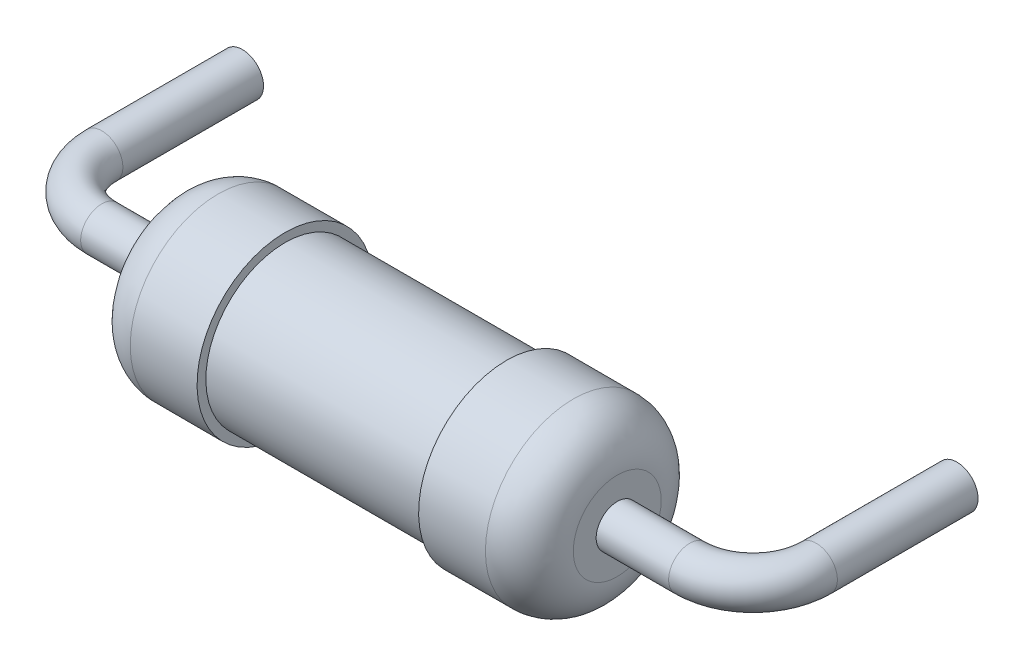
ISO-10303-21;
HEADER;
FILE_DESCRIPTION(('STEP AP214'),'2;1');
FILE_NAME('part.step','',(''),(''),'','','');
FILE_SCHEMA(('AUTOMOTIVE_DESIGN { 1 0 10303 214 1 1 1 1 }'));
ENDSEC;
DATA;
#1=APPLICATION_CONTEXT('core data for automotive mechanical design processes');
#2=APPLICATION_PROTOCOL_DEFINITION('international standard','automotive_design',2000,#1);
#3=PRODUCT_CONTEXT('',#1,'mechanical');
#4=PRODUCT('Part','Part','',(#3));
#5=PRODUCT_RELATED_PRODUCT_CATEGORY('part','',(#4));
#6=PRODUCT_DEFINITION_FORMATION('','',#4);
#7=PRODUCT_DEFINITION_CONTEXT('part definition',#1,'design');
#8=PRODUCT_DEFINITION('design','',#6,#7);
#9=PRODUCT_DEFINITION_SHAPE('','',#8);
#10=(LENGTH_UNIT() NAMED_UNIT(*) SI_UNIT(.MILLI.,.METRE.));
#11=(NAMED_UNIT(*) PLANE_ANGLE_UNIT() SI_UNIT($,.RADIAN.));
#12=(NAMED_UNIT(*) SI_UNIT($,.STERADIAN.) SOLID_ANGLE_UNIT());
#13=UNCERTAINTY_MEASURE_WITH_UNIT(LENGTH_MEASURE(1.E-05),#10,'distance_accuracy_value','');
#14=(GEOMETRIC_REPRESENTATION_CONTEXT(3) GLOBAL_UNCERTAINTY_ASSIGNED_CONTEXT((#13)) GLOBAL_UNIT_ASSIGNED_CONTEXT((#10,
#11,#12)) REPRESENTATION_CONTEXT('',''));
#15=CARTESIAN_POINT('',(0.,0.,0.));
#16=DIRECTION('',(0.,0.,1.));
#17=DIRECTION('',(1.,0.,0.));
#18=AXIS2_PLACEMENT_3D('',#15,#16,#17);
#19=CARTESIAN_POINT('',(10.1599999999998,0.,0.35));
#20=DIRECTION('',(0.,0.,1.));
#21=DIRECTION('',(1.,-5.51018547908294E-13,0.));
#22=AXIS2_PLACEMENT_3D('',#19,#20,#21);
#23=CYLINDRICAL_SURFACE('',#22,0.300000000000225);
#24=CARTESIAN_POINT('',(10.16,0.,0.35));
#25=DIRECTION('',(0.,0.,1.));
#26=DIRECTION('',(-0.829113924050626,0.559079691050725,0.));
#27=AXIS2_PLACEMENT_3D('',#24,#25,#26);
#28=CIRCLE('',#27,0.299999999999989);
#29=CARTESIAN_POINT('',(9.86,0.,0.35));
#30=VERTEX_POINT('',#29);
#31=EDGE_CURVE('E25',#30,#30,#28,.T.);
#32=ORIENTED_EDGE('',*,*,#31,.F.);
#33=DIRECTION('',(0.,0.,-1.));
#34=VECTOR('',#33,1.);
#35=CARTESIAN_POINT('',(9.85999999999955,1.65104899379408E-13,0.35));
#36=LINE('',#35,#34);
#37=CARTESIAN_POINT('',(9.86,0.,-1.64999994635582));
#38=VERTEX_POINT('',#37);
#39=EDGE_CURVE('E11',#30,#38,#36,.T.);
#40=ORIENTED_EDGE('',*,*,#39,.T.);
#41=CARTESIAN_POINT('',(10.1599999999998,0.,-1.64999994635582));
#42=DIRECTION('',(0.,0.,1.));
#43=DIRECTION('',(1.,-5.51018547908294E-13,0.));
#44=AXIS2_PLACEMENT_3D('',#41,#42,#43);
#45=CIRCLE('',#44,0.300000000000225);
#46=EDGE_CURVE('E175',#38,#38,#45,.T.);
#47=ORIENTED_EDGE('',*,*,#46,.T.);
#48=ORIENTED_EDGE('',*,*,#39,.F.);
#49=EDGE_LOOP('',(#32,#40,#47,#48));
#50=FACE_BOUND('',#49,.T.);
#51=ADVANCED_FACE('F17',(#50),#23,.T.);
#52=CARTESIAN_POINT('',(9.25999999999962,-3.80883709701122E-13,0.349999999999632));
#53=DIRECTION('',(3.56489670335381E-13,-1.,2.67467843021535E-13));
#54=DIRECTION('',(0.,-2.67467843021535E-13,-1.));
#55=AXIS2_PLACEMENT_3D('',#52,#53,#54);
#56=TOROIDAL_SURFACE('',#55,0.900000000000287,0.299999999999851);
#57=CARTESIAN_POINT('',(9.26,0.,1.25));
#58=DIRECTION('',(1.,0.,0.));
#59=DIRECTION('',(0.,-0.559079691050551,-0.829113924050742));
#60=AXIS2_PLACEMENT_3D('',#57,#58,#59);
#61=CIRCLE('',#60,0.299999999999987);
#62=CARTESIAN_POINT('',(9.26,0.,0.95));
#63=VERTEX_POINT('',#62);
#64=EDGE_CURVE('E145',#63,#63,#61,.T.);
#65=ORIENTED_EDGE('',*,*,#64,.T.);
#66=CARTESIAN_POINT('',(9.25999999999962,-3.80846970297148E-13,0.349999999999632));
#67=DIRECTION('',(-3.56489670335381E-13,1.,-2.67467843021535E-13));
#68=DIRECTION('',(0.,-2.67467843021535E-13,-1.));
#69=AXIS2_PLACEMENT_3D('',#66,#67,#68);
#70=CIRCLE('',#69,0.600000000000436);
#71=EDGE_CURVE('E44',#63,#30,#70,.T.);
#72=ORIENTED_EDGE('',*,*,#71,.T.);
#73=ORIENTED_EDGE('',*,*,#31,.T.);
#74=ORIENTED_EDGE('',*,*,#71,.F.);
#75=EDGE_LOOP('',(#65,#72,#73,#74));
#76=FACE_BOUND('',#75,.T.);
#77=ADVANCED_FACE('F173',(#76),#56,.T.);
#78=CARTESIAN_POINT('',(8.23,0.,1.24999999999977));
#79=DIRECTION('',(-1.,0.,0.));
#80=DIRECTION('',(0.,-5.51377500943084E-13,1.));
#81=AXIS2_PLACEMENT_3D('',#78,#79,#80);
#82=CYLINDRICAL_SURFACE('',#81,0.300000000000227);
#83=CARTESIAN_POINT('',(8.23,0.,1.25));
#84=DIRECTION('',(1.,0.,0.));
#85=DIRECTION('',(0.,-0.559079691050551,-0.829113924050742));
#86=AXIS2_PLACEMENT_3D('',#83,#84,#85);
#87=CIRCLE('',#86,0.299999999999987);
#88=CARTESIAN_POINT('',(8.23,0.,0.95));
#89=VERTEX_POINT('',#88);
#90=EDGE_CURVE('E165',#89,#89,#87,.T.);
#91=ORIENTED_EDGE('',*,*,#90,.T.);
#92=DIRECTION('',(1.,0.,0.));
#93=VECTOR('',#92,1.);
#94=CARTESIAN_POINT('',(8.23,1.65320271200286E-13,0.949999999999545));
#95=LINE('',#94,#93);
#96=EDGE_CURVE('E148',#89,#63,#95,.T.);
#97=ORIENTED_EDGE('',*,*,#96,.T.);
#98=ORIENTED_EDGE('',*,*,#64,.F.);
#99=ORIENTED_EDGE('',*,*,#96,.F.);
#100=EDGE_LOOP('',(#91,#97,#98,#99));
#101=FACE_BOUND('',#100,.T.);
#102=ADVANCED_FACE('F234',(#101),#82,.T.);
#103=CARTESIAN_POINT('',(8.23,0.625,1.25));
#104=DIRECTION('',(-1.,0.,0.));
#105=DIRECTION('',(0.,0.,1.));
#106=AXIS2_PLACEMENT_3D('',#103,#104,#105);
#107=PLANE('',#106);
#108=ORIENTED_EDGE('',*,*,#90,.F.);
#109=EDGE_LOOP('',(#108));
#110=FACE_BOUND('',#109,.T.);
#111=CARTESIAN_POINT('',(8.23,0.,1.24999999999991));
#112=DIRECTION('',(1.,0.,0.));
#113=DIRECTION('',(0.,0.829113924050749,-0.559079691050541));
#114=AXIS2_PLACEMENT_3D('',#111,#112,#113);
#115=CIRCLE('',#114,0.625);
#116=CARTESIAN_POINT('',(8.23,-4.35651416825784E-13,0.624999999999913));
#117=VERTEX_POINT('',#116);
#118=EDGE_CURVE('E160',#117,#117,#115,.T.);
#119=ORIENTED_EDGE('',*,*,#118,.T.);
#120=EDGE_LOOP('',(#119));
#121=FACE_BOUND('',#120,.T.);
#122=ADVANCED_FACE('F237',(#110,#121),#107,.F.);
#123=CARTESIAN_POINT('',(8.23000000000021,-4.35574876400854E-13,0.625000000000753));
#124=CARTESIAN_POINT('',(8.23000000000015,-0.624999999999856,0.625000000000753));
#125=CARTESIAN_POINT('',(8.23,-0.624999999999857,1.25000000000017));
#126=CARTESIAN_POINT('',(8.22999999999992,-0.624999999999856,1.8749999999996));
#127=CARTESIAN_POINT('',(8.23,-4.35574876400854E-13,1.8749999999996));
#128=CARTESIAN_POINT('',(8.23,0.624999999998985,1.8749999999996));
#129=CARTESIAN_POINT('',(8.23000000000013,0.624999999998985,1.25000000000017));
#130=CARTESIAN_POINT('',(8.23000000000025,0.624999999998985,0.625000000000753));
#131=CARTESIAN_POINT('',(8.23000000000021,-4.35574876400854E-13,0.625000000000753));
#132=CARTESIAN_POINT('',(8.23000000000085,-4.35574876400892E-13,-1.12687636999453E-13));
#133=CARTESIAN_POINT('',(8.23000000000076,-1.25000000000072,-1.12410081243297E-13));
#134=CARTESIAN_POINT('',(8.2300000000005,-1.25000000000072,1.25000000000017));
#135=CARTESIAN_POINT('',(8.23000000000025,-1.25000000000072,2.50000000000046));
#136=CARTESIAN_POINT('',(8.23000000000035,-4.35574876400892E-13,2.50000000000046));
#137=CARTESIAN_POINT('',(8.23000000000043,1.24999999999985,2.50000000000046));
#138=CARTESIAN_POINT('',(8.23000000000068,1.24999999999985,1.25000000000017));
#139=CARTESIAN_POINT('',(8.23000000000095,1.24999999999985,-1.12410081243297E-13));
#140=CARTESIAN_POINT('',(8.23000000000085,-4.35574876400892E-13,-1.12687636999453E-13));
#141=CARTESIAN_POINT('',(7.605,-3.88161724984572E-13,-2.59792187762287E-13));
#142=CARTESIAN_POINT('',(7.60499999999989,-1.25000000000069,-2.5951463200613E-13));
#143=CARTESIAN_POINT('',(7.60499999999964,-1.25000000000069,1.25000000000005));
#144=CARTESIAN_POINT('',(7.60499999999938,-1.25000000000069,2.50000000000035));
#145=CARTESIAN_POINT('',(7.60499999999947,-3.88161724984572E-13,2.50000000000035));
#146=CARTESIAN_POINT('',(7.60499999999956,1.24999999999992,2.50000000000035));
#147=CARTESIAN_POINT('',(7.60499999999982,1.24999999999992,1.25000000000005));
#148=CARTESIAN_POINT('',(7.60500000000009,1.24999999999992,-2.5951463200613E-13));
#149=CARTESIAN_POINT('',(7.605,-3.88161724984572E-13,-2.59792187762287E-13));
#150=(BOUNDED_SURFACE() B_SPLINE_SURFACE(2,2,((#123,#124,#125,#126,#127,#128,#129,#130,#131),
(#132,#133,#134,#135,#136,#137,#138,#139,#140),(#141,#142,#143,#144,#145,#146,#147,#148,#149)),
.UNSPECIFIED.,.F.,.T.,.F.) B_SPLINE_SURFACE_WITH_KNOTS((3,3),(3,2,2,2,3),(-1.57079632679571,0.),
(-3.14159265358979,-1.5707963267949,0.,1.5707963267949,3.14159265358979),
.UNSPECIFIED.) GEOMETRIC_REPRESENTATION_ITEM() RATIONAL_B_SPLINE_SURFACE(((1.,0.707106781186548,
1.,0.707106781186548,1.,0.707106781186548,1.,0.707106781186548,1.),(0.707106781186268,
0.499999999999802,0.707106781186268,0.499999999999802,0.707106781186268,0.499999999999802,
0.707106781186268,0.499999999999802,0.707106781186268),(1.,0.707106781186548,1.,
0.707106781186548,1.,0.707106781186548,1.,0.707106781186548,1.))) REPRESENTATION_ITEM('') SURFACE());
#151=CARTESIAN_POINT('',(7.605,0.,1.24999999999998));
#152=DIRECTION('',(1.,0.,0.));
#153=DIRECTION('',(0.,0.829113924050755,-0.559079691050533));
#154=AXIS2_PLACEMENT_3D('',#151,#152,#153);
#155=CIRCLE('',#154,1.25000000000003);
#156=CARTESIAN_POINT('',(7.605,1.25,1.25));
#157=VERTEX_POINT('',#156);
#158=CARTESIAN_POINT('',(7.605,-3.88314805834467E-13,0.));
#159=VERTEX_POINT('',#158);
#160=EDGE_CURVE('E120',#157,#159,#155,.T.);
#161=CARTESIAN_POINT('',(7.60499999999984,-3.88238265409517E-13,0.625000000000114));
#162=DIRECTION('',(0.,-1.,0.));
#163=DIRECTION('',(2.04281036530979E-13,0.,-1.));
#164=AXIS2_PLACEMENT_3D('',#161,#162,#163);
#165=CIRCLE('',#164,0.625000000000374);
#166=EDGE_CURVE('E156',#159,#117,#165,.T.);
#167=CARTESIAN_POINT('',(7.605,0.,1.24999999999998));
#168=DIRECTION('',(1.,0.,0.));
#169=DIRECTION('',(0.,0.829113924050755,-0.559079691050533));
#170=AXIS2_PLACEMENT_3D('',#167,#168,#169);
#171=CIRCLE('',#170,1.25000000000003);
#172=EDGE_CURVE('E152',#159,#157,#171,.T.);
#173=ORIENTED_EDGE('',*,*,#160,.T.);
#174=ORIENTED_EDGE('',*,*,#166,.T.);
#175=ORIENTED_EDGE('',*,*,#118,.F.);
#176=ORIENTED_EDGE('',*,*,#166,.F.);
#177=ORIENTED_EDGE('',*,*,#172,.T.);
#178=EDGE_LOOP('',(#173,#174,#175,#176,#177));
#179=FACE_BOUND('',#178,.T.);
#180=ADVANCED_FACE('F240',(#179),#150,.F.);
#181=CARTESIAN_POINT('',(2.27283469822481E-13,0.,-3.));
#182=DIRECTION('',(0.,0.,-1.));
#183=DIRECTION('',(-1.,-5.51511040018528E-13,0.));
#184=AXIS2_PLACEMENT_3D('',#181,#182,#183);
#185=CYLINDRICAL_SURFACE('',#184,0.300000000000227);
#186=CARTESIAN_POINT('',(2.27283469822481E-13,0.,-1.64999994635582));
#187=DIRECTION('',(0.,0.,1.));
#188=DIRECTION('',(-1.,-5.51511040018528E-13,0.));
#189=AXIS2_PLACEMENT_3D('',#186,#187,#188);
#190=CIRCLE('',#189,0.300000000000227);
#191=CARTESIAN_POINT('',(0.3,0.,-1.64999994635582));
#192=VERTEX_POINT('',#191);
#193=EDGE_CURVE('E179',#192,#192,#190,.T.);
#194=ORIENTED_EDGE('',*,*,#193,.T.);
#195=DIRECTION('',(0.,0.,1.));
#196=VECTOR('',#195,1.);
#197=CARTESIAN_POINT('',(0.300000000000455,1.65400394645552E-13,-3.));
#198=LINE('',#197,#196);
#199=CARTESIAN_POINT('',(0.3,0.,0.35));
#200=VERTEX_POINT('',#199);
#201=EDGE_CURVE('E155',#192,#200,#198,.T.);
#202=ORIENTED_EDGE('',*,*,#201,.T.);
#203=CARTESIAN_POINT('',(0.,0.,0.35));
#204=DIRECTION('',(0.,0.,1.));
#205=DIRECTION('',(0.829113924050743,-0.559079691050551,0.));
#206=AXIS2_PLACEMENT_3D('',#203,#204,#205);
#207=CIRCLE('',#206,0.299999999999987);
#208=EDGE_CURVE('E118',#200,#200,#207,.T.);
#209=ORIENTED_EDGE('',*,*,#208,.F.);
#210=ORIENTED_EDGE('',*,*,#201,.F.);
#211=EDGE_LOOP('',(#194,#202,#209,#210));
#212=FACE_BOUND('',#211,.T.);
#213=ADVANCED_FACE('F410',(#212),#185,.T.);
#214=CARTESIAN_POINT('',(7.605,-1.02001740387436E-13,1.25));
#215=DIRECTION('',(1.,0.,0.));
#216=DIRECTION('',(0.,-1.,5.51558798633823E-13));
#217=AXIS2_PLACEMENT_3D('',#214,#215,#216);
#218=CYLINDRICAL_SURFACE('',#217,1.2499999999999);
#219=ORIENTED_EDGE('',*,*,#160,.F.);
#220=DIRECTION('',(-1.,0.,0.));
#221=VECTOR('',#220,1.);
#222=CARTESIAN_POINT('',(7.605,1.2499999999998,1.24999999999931));
#223=LINE('',#222,#221);
#224=CARTESIAN_POINT('',(6.655,1.25,1.25));
#225=VERTEX_POINT('',#224);
#226=EDGE_CURVE('E142',#157,#225,#223,.T.);
#227=ORIENTED_EDGE('',*,*,#226,.T.);
#228=CARTESIAN_POINT('',(6.655,0.,1.24999999999998));
#229=DIRECTION('',(1.,0.,0.));
#230=DIRECTION('',(0.,0.829113924050755,-0.559079691050533));
#231=AXIS2_PLACEMENT_3D('',#228,#229,#230);
#232=CIRCLE('',#231,1.25000000000003);
#233=EDGE_CURVE('E129',#225,#225,#232,.T.);
#234=ORIENTED_EDGE('',*,*,#233,.T.);
#235=ORIENTED_EDGE('',*,*,#226,.F.);
#236=ORIENTED_EDGE('',*,*,#172,.F.);
#237=EDGE_LOOP('',(#219,#227,#234,#235,#236));
#238=FACE_BOUND('',#237,.T.);
#239=ADVANCED_FACE('F248',(#238),#218,.T.);
#240=CARTESIAN_POINT('',(0.900000000000377,-3.63692008992207E-13,0.349999999999616));
#241=DIRECTION('',(-2.50611026152485E-13,-1.,3.44823994173089E-13));
#242=DIRECTION('',(0.,-3.44823994173089E-13,-1.));
#243=AXIS2_PLACEMENT_3D('',#240,#241,#242);
#244=TOROIDAL_SURFACE('',#243,0.900000000000299,0.299999999999852);
#245=ORIENTED_EDGE('',*,*,#208,.T.);
#246=CARTESIAN_POINT('',(0.900000000000377,-3.63655269588233E-13,0.349999999999616));
#247=DIRECTION('',(2.50611026152485E-13,1.,-3.44823994173089E-13));
#248=DIRECTION('',(0.,-3.44823994173089E-13,-1.));
#249=AXIS2_PLACEMENT_3D('',#246,#247,#248);
#250=CIRCLE('',#249,0.600000000000447);
#251=CARTESIAN_POINT('',(0.9,0.,0.95));
#252=VERTEX_POINT('',#251);
#253=EDGE_CURVE('E112',#200,#252,#250,.T.);
#254=ORIENTED_EDGE('',*,*,#253,.T.);
#255=CARTESIAN_POINT('',(0.9,0.,1.25));
#256=DIRECTION('',(-1.,0.,0.));
#257=DIRECTION('',(0.,0.559079691050724,-0.829113924050626));
#258=AXIS2_PLACEMENT_3D('',#255,#256,#257);
#259=CIRCLE('',#258,0.299999999999987);
#260=EDGE_CURVE('E116',#252,#252,#259,.T.);
#261=ORIENTED_EDGE('',*,*,#260,.T.);
#262=ORIENTED_EDGE('',*,*,#253,.F.);
#263=EDGE_LOOP('',(#245,#254,#261,#262));
#264=FACE_BOUND('',#263,.T.);
#265=ADVANCED_FACE('F114',(#264),#244,.T.);
#266=CARTESIAN_POINT('',(6.655,1.25,1.25));
#267=DIRECTION('',(-1.,0.,0.));
#268=DIRECTION('',(0.,0.,1.));
#269=AXIS2_PLACEMENT_3D('',#266,#267,#268);
#270=PLANE('',#269);
#271=CARTESIAN_POINT('',(6.655,0.,1.24999999999996));
#272=DIRECTION('',(-1.,0.,0.));
#273=DIRECTION('',(0.,0.829113924050744,0.559079691050549));
#274=AXIS2_PLACEMENT_3D('',#271,#272,#273);
#275=CIRCLE('',#274,1.12499999999996);
#276=CARTESIAN_POINT('',(6.655,1.125,1.25));
#277=VERTEX_POINT('',#276);
#278=EDGE_CURVE('E195',#277,#277,#275,.T.);
#279=ORIENTED_EDGE('',*,*,#278,.F.);
#280=EDGE_LOOP('',(#279));
#281=FACE_BOUND('',#280,.T.);
#282=ORIENTED_EDGE('',*,*,#233,.F.);
#283=EDGE_LOOP('',(#282));
#284=FACE_BOUND('',#283,.T.);
#285=ADVANCED_FACE('F343',(#281,#284),#270,.T.);
#286=CARTESIAN_POINT('',(0.9,0.,1.24999999999977));
#287=DIRECTION('',(-1.,0.,0.));
#288=DIRECTION('',(0.,-5.51377500943084E-13,1.));
#289=AXIS2_PLACEMENT_3D('',#286,#287,#288);
#290=CYLINDRICAL_SURFACE('',#289,0.300000000000227);
#291=ORIENTED_EDGE('',*,*,#260,.F.);
#292=DIRECTION('',(1.,0.,0.));
#293=VECTOR('',#292,1.);
#294=CARTESIAN_POINT('',(0.9,1.65320271200286E-13,0.949999999999545));
#295=LINE('',#294,#293);
#296=CARTESIAN_POINT('',(1.93,0.,0.95));
#297=VERTEX_POINT('',#296);
#298=EDGE_CURVE('E124',#252,#297,#295,.T.);
#299=ORIENTED_EDGE('',*,*,#298,.T.);
#300=CARTESIAN_POINT('',(1.93,0.,1.25));
#301=DIRECTION('',(1.,0.,0.));
#302=DIRECTION('',(0.,-0.559079691050551,-0.829113924050742));
#303=AXIS2_PLACEMENT_3D('',#300,#301,#302);
#304=CIRCLE('',#303,0.299999999999987);
#305=EDGE_CURVE('E127',#297,#297,#304,.T.);
#306=ORIENTED_EDGE('',*,*,#305,.F.);
#307=ORIENTED_EDGE('',*,*,#298,.F.);
#308=EDGE_LOOP('',(#291,#299,#306,#307));
#309=FACE_BOUND('',#308,.T.);
#310=ADVANCED_FACE('F125',(#309),#290,.T.);
#311=CARTESIAN_POINT('',(6.655,0.,1.25));
#312=DIRECTION('',(1.,0.,0.));
#313=DIRECTION('',(0.,-1.,5.51410768897133E-13));
#314=AXIS2_PLACEMENT_3D('',#311,#312,#313);
#315=CYLINDRICAL_SURFACE('',#314,1.12500000000006);
#316=ORIENTED_EDGE('',*,*,#278,.T.);
#317=DIRECTION('',(-1.,0.,0.));
#318=VECTOR('',#317,1.);
#319=CARTESIAN_POINT('',(6.655,1.12500000000012,1.24999999999938));
#320=LINE('',#319,#318);
#321=CARTESIAN_POINT('',(3.505,1.125,1.25));
#322=VERTEX_POINT('',#321);
#323=EDGE_CURVE('E138',#277,#322,#320,.T.);
#324=ORIENTED_EDGE('',*,*,#323,.T.);
#325=CARTESIAN_POINT('',(3.505,0.,1.24999999999996));
#326=DIRECTION('',(-1.,0.,0.));
#327=DIRECTION('',(0.,0.829113924050744,0.559079691050549));
#328=AXIS2_PLACEMENT_3D('',#325,#326,#327);
#329=CIRCLE('',#328,1.12499999999996);
#330=EDGE_CURVE('E200',#322,#322,#329,.T.);
#331=ORIENTED_EDGE('',*,*,#330,.F.);
#332=ORIENTED_EDGE('',*,*,#323,.F.);
#333=EDGE_LOOP('',(#316,#324,#331,#332));
#334=FACE_BOUND('',#333,.T.);
#335=ADVANCED_FACE('F350',(#334),#315,.T.);
#336=CARTESIAN_POINT('',(1.93,0.625,1.25));
#337=DIRECTION('',(-1.,0.,0.));
#338=DIRECTION('',(0.,0.,1.));
#339=AXIS2_PLACEMENT_3D('',#336,#337,#338);
#340=PLANE('',#339);
#341=ORIENTED_EDGE('',*,*,#305,.T.);
#342=EDGE_LOOP('',(#341));
#343=FACE_BOUND('',#342,.T.);
#344=CARTESIAN_POINT('',(1.93,0.,1.24999999999991));
#345=DIRECTION('',(1.,0.,0.));
#346=DIRECTION('',(0.,0.829113924050749,-0.559079691050541));
#347=AXIS2_PLACEMENT_3D('',#344,#345,#346);
#348=CIRCLE('',#347,0.625);
#349=CARTESIAN_POINT('',(1.93,-4.39978178240688E-13,1.87499999999991));
#350=VERTEX_POINT('',#349);
#351=EDGE_CURVE('E192',#350,#350,#348,.T.);
#352=ORIENTED_EDGE('',*,*,#351,.F.);
#353=EDGE_LOOP('',(#352));
#354=FACE_BOUND('',#353,.T.);
#355=ADVANCED_FACE('F354',(#343,#354),#340,.T.);
#356=CARTESIAN_POINT('',(3.505,1.25,1.25));
#357=DIRECTION('',(-1.,0.,0.));
#358=DIRECTION('',(0.,0.,1.));
#359=AXIS2_PLACEMENT_3D('',#356,#357,#358);
#360=PLANE('',#359);
#361=ORIENTED_EDGE('',*,*,#330,.T.);
#362=EDGE_LOOP('',(#361));
#363=FACE_BOUND('',#362,.T.);
#364=CARTESIAN_POINT('',(3.505,0.,1.24999999999998));
#365=DIRECTION('',(1.,0.,0.));
#366=DIRECTION('',(0.,0.829113924050755,-0.559079691050533));
#367=AXIS2_PLACEMENT_3D('',#364,#365,#366);
#368=CIRCLE('',#367,1.25000000000003);
#369=CARTESIAN_POINT('',(3.505,1.25,1.25));
#370=VERTEX_POINT('',#369);
#371=EDGE_CURVE('E178',#370,#370,#368,.T.);
#372=ORIENTED_EDGE('',*,*,#371,.T.);
#373=EDGE_LOOP('',(#372));
#374=FACE_BOUND('',#373,.T.);
#375=ADVANCED_FACE('F383',(#363,#374),#360,.F.);
#376=CARTESIAN_POINT('',(1.92999999999979,-4.39901637815758E-13,1.87499999999933));
#377=CARTESIAN_POINT('',(1.92999999999984,-0.624999999999949,1.87499999999933));
#378=CARTESIAN_POINT('',(1.92999999999997,-0.624999999999949,1.24999999999982));
#379=CARTESIAN_POINT('',(1.93000000000009,-0.624999999999949,0.625000000000314));
#380=CARTESIAN_POINT('',(1.93000000000004,-4.39901637815758E-13,0.625000000000314));
#381=CARTESIAN_POINT('',(1.92999999999999,0.62499999999907,0.625000000000314));
#382=CARTESIAN_POINT('',(1.92999999999986,0.62499999999907,1.24999999999982));
#383=CARTESIAN_POINT('',(1.92999999999973,0.62499999999907,1.87499999999933));
#384=CARTESIAN_POINT('',(1.92999999999979,-4.39901637815758E-13,1.87499999999933));
#385=CARTESIAN_POINT('',(1.92999999999924,-4.39901637815793E-13,2.50000000000012));
#386=CARTESIAN_POINT('',(1.92999999999934,-1.25000000000073,2.50000000000012));
#387=CARTESIAN_POINT('',(1.9299999999996,-1.25000000000073,1.24999999999982));
#388=CARTESIAN_POINT('',(1.92999999999985,-1.25000000000073,-4.69346783660285E-13));
#389=CARTESIAN_POINT('',(1.92999999999975,-4.39901637815793E-13,-4.69624339416441E-13));
#390=CARTESIAN_POINT('',(1.92999999999965,1.24999999999985,-4.69346783660285E-13));
#391=CARTESIAN_POINT('',(1.92999999999939,1.24999999999985,1.24999999999982));
#392=CARTESIAN_POINT('',(1.92999999999913,1.24999999999985,2.50000000000012));
#393=CARTESIAN_POINT('',(1.92999999999924,-4.39901637815793E-13,2.50000000000012));
#394=CARTESIAN_POINT('',(2.555,-3.88925003314001E-13,2.50000000000026));
#395=CARTESIAN_POINT('',(2.55500000000012,-1.2500000000007,2.50000000000026));
#396=CARTESIAN_POINT('',(2.55500000000038,-1.2500000000007,1.24999999999995));
#397=CARTESIAN_POINT('',(2.55500000000064,-1.2500000000007,-3.53606033343112E-13));
#398=CARTESIAN_POINT('',(2.55500000000054,-3.88925003314001E-13,-3.53883589099269E-13));
#399=CARTESIAN_POINT('',(2.55500000000043,1.24999999999992,-3.53606033343112E-13));
#400=CARTESIAN_POINT('',(2.55500000000018,1.24999999999992,1.24999999999995));
#401=CARTESIAN_POINT('',(2.55499999999992,1.24999999999992,2.50000000000026));
#402=CARTESIAN_POINT('',(2.555,-3.88925003314001E-13,2.50000000000026));
#403=(BOUNDED_SURFACE() B_SPLINE_SURFACE(2,2,((#376,#377,#378,#379,#380,#381,#382,#383,#384),
(#385,#386,#387,#388,#389,#390,#391,#392,#393),(#394,#395,#396,#397,#398,#399,#400,#401,#402)),
.UNSPECIFIED.,.F.,.T.,.F.) B_SPLINE_SURFACE_WITH_KNOTS((3,3),(3,2,2,2,3),(-1.57079632679557,0.),
(-3.14159265358979,-1.5707963267949,0.,1.5707963267949,3.14159265358979),
.UNSPECIFIED.) GEOMETRIC_REPRESENTATION_ITEM() RATIONAL_B_SPLINE_SURFACE(((1.,0.707106781186548,
1.,0.707106781186548,1.,0.707106781186548,1.,0.707106781186548,1.),(0.707106781186317,
0.499999999999837,0.707106781186317,0.499999999999837,0.707106781186317,0.499999999999837,
0.707106781186317,0.499999999999837,0.707106781186317),(1.,0.707106781186548,1.,
0.707106781186548,1.,0.707106781186548,1.,0.707106781186548,1.))) REPRESENTATION_ITEM('') SURFACE());
#404=CARTESIAN_POINT('',(2.555,0.,1.24999999999998));
#405=DIRECTION('',(1.,0.,0.));
#406=DIRECTION('',(0.,0.829113924050755,-0.559079691050533));
#407=AXIS2_PLACEMENT_3D('',#404,#405,#406);
#408=CIRCLE('',#407,1.25000000000003);
#409=CARTESIAN_POINT('',(2.555,1.25,1.25));
#410=VERTEX_POINT('',#409);
#411=CARTESIAN_POINT('',(2.555,-3.89078084163896E-13,2.5));
#412=VERTEX_POINT('',#411);
#413=EDGE_CURVE('E207',#410,#412,#408,.T.);
#414=CARTESIAN_POINT('',(2.555,0.,1.24999999999998));
#415=DIRECTION('',(1.,0.,0.));
#416=DIRECTION('',(0.,0.829113924050755,-0.559079691050533));
#417=AXIS2_PLACEMENT_3D('',#414,#415,#416);
#418=CIRCLE('',#417,1.25000000000003);
#419=EDGE_CURVE('E211',#412,#410,#418,.T.);
#420=CARTESIAN_POINT('',(2.55500000000016,-3.89001543738947E-13,1.87499999999988));
#421=DIRECTION('',(0.,-1.,0.));
#422=DIRECTION('',(-2.06501482580228E-13,0.,1.));
#423=AXIS2_PLACEMENT_3D('',#420,#421,#422);
#424=CIRCLE('',#423,0.625000000000376);
#425=EDGE_CURVE('E214',#412,#350,#424,.T.);
#426=ORIENTED_EDGE('',*,*,#413,.F.);
#427=ORIENTED_EDGE('',*,*,#419,.F.);
#428=ORIENTED_EDGE('',*,*,#425,.T.);
#429=ORIENTED_EDGE('',*,*,#351,.T.);
#430=ORIENTED_EDGE('',*,*,#425,.F.);
#431=EDGE_LOOP('',(#426,#427,#428,#429,#430));
#432=FACE_BOUND('',#431,.T.);
#433=ADVANCED_FACE('F374',(#432),#403,.F.);
#434=CARTESIAN_POINT('',(3.505,-1.01862962509358E-13,1.25));
#435=DIRECTION('',(1.,0.,0.));
#436=DIRECTION('',(0.,-1.,5.51558798633823E-13));
#437=AXIS2_PLACEMENT_3D('',#434,#435,#436);
#438=CYLINDRICAL_SURFACE('',#437,1.2499999999999);
#439=ORIENTED_EDGE('',*,*,#371,.F.);
#440=DIRECTION('',(-1.,0.,0.));
#441=VECTOR('',#440,1.);
#442=CARTESIAN_POINT('',(3.505,1.2499999999998,1.24999999999931));
#443=LINE('',#442,#441);
#444=EDGE_CURVE('E186',#370,#410,#443,.T.);
#445=ORIENTED_EDGE('',*,*,#444,.T.);
#446=ORIENTED_EDGE('',*,*,#413,.T.);
#447=ORIENTED_EDGE('',*,*,#419,.T.);
#448=ORIENTED_EDGE('',*,*,#444,.F.);
#449=EDGE_LOOP('',(#439,#445,#446,#447,#448));
#450=FACE_BOUND('',#449,.T.);
#451=ADVANCED_FACE('F364',(#450),#438,.T.);
#452=CARTESIAN_POINT('',(10.16,-0.3,-1.64999994635582));
#453=DIRECTION('',(0.,0.,1.));
#454=DIRECTION('',(1.,0.,0.));
#455=AXIS2_PLACEMENT_3D('',#452,#453,#454);
#456=PLANE('',#455);
#457=ORIENTED_EDGE('',*,*,#46,.F.);
#458=EDGE_LOOP('',(#457));
#459=FACE_BOUND('',#458,.T.);
#460=ADVANCED_FACE('F330',(#459),#456,.F.);
#461=CARTESIAN_POINT('',(0.,-0.3,-1.64999994635582));
#462=DIRECTION('',(0.,0.,-1.));
#463=DIRECTION('',(0.,-1.,0.));
#464=AXIS2_PLACEMENT_3D('',#461,#462,#463);
#465=PLANE('',#464);
#466=ORIENTED_EDGE('',*,*,#193,.F.);
#467=EDGE_LOOP('',(#466));
#468=FACE_BOUND('',#467,.T.);
#469=ADVANCED_FACE('F324',(#468),#465,.T.);
#470=CLOSED_SHELL('',(#51,#77,#102,#122,#180,#213,#239,#265,#285,#310,#335,#355,#375,#433,#451,
#460,#469));
#471=MANIFOLD_SOLID_BREP('B1',#470);
#472=ADVANCED_BREP_SHAPE_REPRESENTATION('',(#18,#471),#14);
#473=SHAPE_DEFINITION_REPRESENTATION(#9,#472);
ENDSEC;
END-ISO-10303-21;
